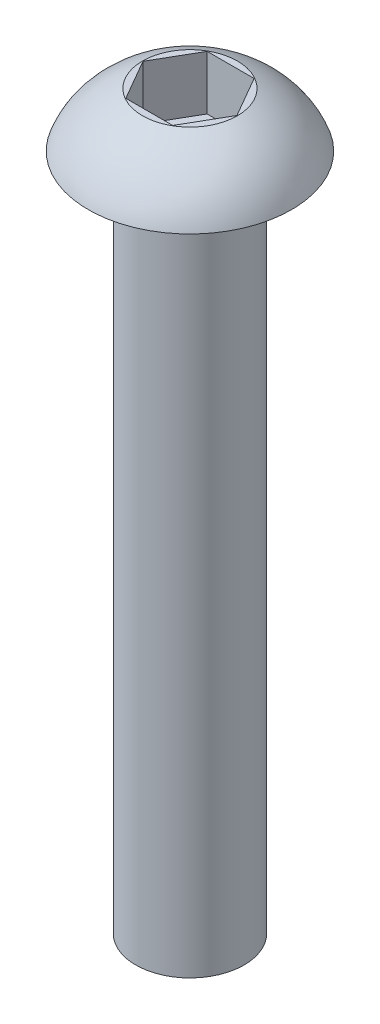
ISO-10303-21;
HEADER;
FILE_DESCRIPTION(('STEP AP214'),'2;1');
FILE_NAME('part.step','',(''),(''),'','','');
FILE_SCHEMA(('AUTOMOTIVE_DESIGN { 1 0 10303 214 1 1 1 1 }'));
ENDSEC;
DATA;
#1=APPLICATION_CONTEXT('core data for automotive mechanical design processes');
#2=APPLICATION_PROTOCOL_DEFINITION('international standard','automotive_design',2000,#1);
#3=PRODUCT_CONTEXT('',#1,'mechanical');
#4=PRODUCT('Part','Part','',(#3));
#5=PRODUCT_RELATED_PRODUCT_CATEGORY('part','',(#4));
#6=PRODUCT_DEFINITION_FORMATION('','',#4);
#7=PRODUCT_DEFINITION_CONTEXT('part definition',#1,'design');
#8=PRODUCT_DEFINITION('design','',#6,#7);
#9=PRODUCT_DEFINITION_SHAPE('','',#8);
#10=(LENGTH_UNIT() NAMED_UNIT(*) SI_UNIT(.MILLI.,.METRE.));
#11=(NAMED_UNIT(*) PLANE_ANGLE_UNIT() SI_UNIT($,.RADIAN.));
#12=(NAMED_UNIT(*) SI_UNIT($,.STERADIAN.) SOLID_ANGLE_UNIT());
#13=UNCERTAINTY_MEASURE_WITH_UNIT(LENGTH_MEASURE(1.E-05),#10,'distance_accuracy_value','');
#14=(GEOMETRIC_REPRESENTATION_CONTEXT(3) GLOBAL_UNCERTAINTY_ASSIGNED_CONTEXT((#13)) GLOBAL_UNIT_ASSIGNED_CONTEXT((#10,
#11,#12)) REPRESENTATION_CONTEXT('',''));
#15=CARTESIAN_POINT('',(0.,0.,0.));
#16=DIRECTION('',(0.,0.,1.));
#17=DIRECTION('',(1.,0.,0.));
#18=AXIS2_PLACEMENT_3D('',#15,#16,#17);
#19=CARTESIAN_POINT('',(0.,-12.5,0.999999999999997));
#20=DIRECTION('',(0.,-1.,0.));
#21=DIRECTION('',(0.,0.,-1.));
#22=AXIS2_PLACEMENT_3D('',#19,#20,#21);
#23=CYLINDRICAL_SURFACE('',#22,2.);
#24=CARTESIAN_POINT('',(0.,-12.5,0.999999999999997));
#25=DIRECTION('',(0.,-1.,0.));
#26=DIRECTION('',(0.,0.,-1.));
#27=AXIS2_PLACEMENT_3D('',#24,#25,#26);
#28=CIRCLE('',#27,2.);
#29=CARTESIAN_POINT('',(0.,-12.5,-1.));
#30=VERTEX_POINT('',#29);
#31=EDGE_CURVE('E165',#30,#30,#28,.T.);
#32=ORIENTED_EDGE('',*,*,#31,.F.);
#33=EDGE_LOOP('',(#32));
#34=FACE_BOUND('',#33,.T.);
#35=CARTESIAN_POINT('',(0.,12.5,1.));
#36=DIRECTION('',(0.,-1.,0.));
#37=DIRECTION('',(0.,0.,-1.));
#38=AXIS2_PLACEMENT_3D('',#35,#36,#37);
#39=CIRCLE('',#38,2.);
#40=CARTESIAN_POINT('',(0.,12.5,-1.));
#41=VERTEX_POINT('',#40);
#42=EDGE_CURVE('E11',#41,#41,#39,.T.);
#43=ORIENTED_EDGE('',*,*,#42,.T.);
#44=EDGE_LOOP('',(#43));
#45=FACE_BOUND('',#44,.T.);
#46=ADVANCED_FACE('F39',(#34,#45),#23,.T.);
#47=CARTESIAN_POINT('',(0.,12.5,0.));
#48=DIRECTION('',(0.,-1.,0.));
#49=DIRECTION('',(0.,0.,-1.));
#50=AXIS2_PLACEMENT_3D('',#47,#48,#49);
#51=PLANE('',#50);
#52=CARTESIAN_POINT('',(0.,12.5,1.));
#53=DIRECTION('',(0.,-1.,0.));
#54=DIRECTION('',(0.,0.,-1.));
#55=AXIS2_PLACEMENT_3D('',#52,#53,#54);
#56=CIRCLE('',#55,3.75);
#57=CARTESIAN_POINT('',(0.,12.5,-2.75));
#58=VERTEX_POINT('',#57);
#59=EDGE_CURVE('E47',#58,#58,#56,.T.);
#60=ORIENTED_EDGE('',*,*,#59,.T.);
#61=EDGE_LOOP('',(#60));
#62=FACE_BOUND('',#61,.T.);
#63=ORIENTED_EDGE('',*,*,#42,.F.);
#64=EDGE_LOOP('',(#63));
#65=FACE_BOUND('',#64,.T.);
#66=ADVANCED_FACE('F178',(#62,#65),#51,.T.);
#67=CARTESIAN_POINT('',(0.,14.5,-0.750000000000003));
#68=CARTESIAN_POINT('',(0.,13.8195725340855,-2.29097588116488));
#69=CARTESIAN_POINT('',(0.,12.5,-2.75));
#70=B_SPLINE_CURVE_WITH_KNOTS('',2,(#67,#68,#69),.UNSPECIFIED.,.F.,.F.,(3,3),(0.,
0.856055688663619),.UNSPECIFIED.);
#71=CARTESIAN_POINT('',(0.,-12.5,0.999999999999997));
#72=DIRECTION('',(0.,-1.,0.));
#73=AXIS1_PLACEMENT('',#71,#72);
#74=SURFACE_OF_REVOLUTION('',#70,#73);
#75=ORIENTED_EDGE('',*,*,#59,.F.);
#76=EDGE_LOOP('',(#75));
#77=FACE_BOUND('',#76,.T.);
#78=CARTESIAN_POINT('',(0.,14.5,1.));
#79=DIRECTION('',(0.,1.,0.));
#80=DIRECTION('',(0.,0.,1.));
#81=AXIS2_PLACEMENT_3D('',#78,#79,#80);
#82=CIRCLE('',#81,1.75);
#83=CARTESIAN_POINT('',(0.,14.5,2.75));
#84=VERTEX_POINT('',#83);
#85=EDGE_CURVE('E109',#84,#84,#82,.T.);
#86=ORIENTED_EDGE('',*,*,#85,.F.);
#87=EDGE_LOOP('',(#86));
#88=FACE_BOUND('',#87,.T.);
#89=ADVANCED_FACE('F174',(#77,#88),#74,.T.);
#90=CARTESIAN_POINT('',(0.,-12.5,0.));
#91=DIRECTION('',(0.,-1.,0.));
#92=DIRECTION('',(0.,0.,-1.));
#93=AXIS2_PLACEMENT_3D('',#90,#91,#92);
#94=PLANE('',#93);
#95=ORIENTED_EDGE('',*,*,#31,.T.);
#96=EDGE_LOOP('',(#95));
#97=FACE_BOUND('',#96,.T.);
#98=ADVANCED_FACE('F177',(#97),#94,.T.);
#99=CARTESIAN_POINT('',(0.,14.5,1.));
#100=DIRECTION('',(0.,1.,0.));
#101=DIRECTION('',(0.,0.,1.));
#102=AXIS2_PLACEMENT_3D('',#99,#100,#101);
#103=PLANE('',#102);
#104=ORIENTED_EDGE('',*,*,#85,.T.);
#105=EDGE_LOOP('',(#104));
#106=FACE_BOUND('',#105,.T.);
#107=DIRECTION('',(-0.5,0.,-0.866025403784438));
#108=VECTOR('',#107,1.);
#109=CARTESIAN_POINT('',(1.73205080756888,14.5,1.));
#110=LINE('',#109,#108);
#111=CARTESIAN_POINT('',(1.73205080756888,14.5,1.));
#112=VERTEX_POINT('',#111);
#113=CARTESIAN_POINT('',(0.866025403784438,14.5,-0.5));
#114=VERTEX_POINT('',#113);
#115=EDGE_CURVE('E100',#112,#114,#110,.T.);
#116=ORIENTED_EDGE('',*,*,#115,.F.);
#117=DIRECTION('',(0.5,0.,-0.866025403784439));
#118=VECTOR('',#117,1.);
#119=CARTESIAN_POINT('',(0.866025403784438,14.5,2.5));
#120=LINE('',#119,#118);
#121=CARTESIAN_POINT('',(0.866025403784438,14.5,2.5));
#122=VERTEX_POINT('',#121);
#123=EDGE_CURVE('E91',#122,#112,#120,.T.);
#124=ORIENTED_EDGE('',*,*,#123,.F.);
#125=DIRECTION('',(1.,0.,0.));
#126=VECTOR('',#125,1.);
#127=CARTESIAN_POINT('',(-0.866025403784439,14.5,2.5));
#128=LINE('',#127,#126);
#129=CARTESIAN_POINT('',(-0.866025403784439,14.5,2.5));
#130=VERTEX_POINT('',#129);
#131=EDGE_CURVE('E127',#130,#122,#128,.T.);
#132=ORIENTED_EDGE('',*,*,#131,.F.);
#133=DIRECTION('',(0.5,0.,0.866025403784439));
#134=VECTOR('',#133,1.);
#135=CARTESIAN_POINT('',(-1.73205080756888,14.5,1.));
#136=LINE('',#135,#134);
#137=CARTESIAN_POINT('',(-1.73205080756888,14.5,1.));
#138=VERTEX_POINT('',#137);
#139=EDGE_CURVE('E124',#138,#130,#136,.T.);
#140=ORIENTED_EDGE('',*,*,#139,.F.);
#141=DIRECTION('',(-0.5,0.,0.866025403784439));
#142=VECTOR('',#141,1.);
#143=CARTESIAN_POINT('',(-0.866025403784439,14.5,-0.5));
#144=LINE('',#143,#142);
#145=CARTESIAN_POINT('',(-0.866025403784439,14.5,-0.5));
#146=VERTEX_POINT('',#145);
#147=EDGE_CURVE('E119',#146,#138,#144,.T.);
#148=ORIENTED_EDGE('',*,*,#147,.F.);
#149=DIRECTION('',(-1.,0.,0.));
#150=VECTOR('',#149,1.);
#151=CARTESIAN_POINT('',(0.866025403784438,14.5,-0.5));
#152=LINE('',#151,#150);
#153=EDGE_CURVE('E115',#114,#146,#152,.T.);
#154=ORIENTED_EDGE('',*,*,#153,.F.);
#155=EDGE_LOOP('',(#116,#124,#132,#140,#148,#154));
#156=FACE_BOUND('',#155,.T.);
#157=ADVANCED_FACE('F113',(#106,#156),#103,.T.);
#158=CARTESIAN_POINT('',(0.866025403784438,14.5,2.5));
#159=DIRECTION('',(-0.866025403784439,0.,-0.5));
#160=DIRECTION('',(-0.5,0.,0.866025403784439));
#161=AXIS2_PLACEMENT_3D('',#158,#159,#160);
#162=PLANE('',#161);
#163=DIRECTION('',(0.5,0.,-0.866025403784439));
#164=VECTOR('',#163,1.);
#165=CARTESIAN_POINT('',(0.866025403784438,12.5,2.5));
#166=LINE('',#165,#164);
#167=CARTESIAN_POINT('',(0.866025403784438,12.5,2.5));
#168=VERTEX_POINT('',#167);
#169=CARTESIAN_POINT('',(1.73205080756888,12.5,1.));
#170=VERTEX_POINT('',#169);
#171=EDGE_CURVE('E130',#168,#170,#166,.T.);
#172=ORIENTED_EDGE('',*,*,#171,.F.);
#173=DIRECTION('',(0.,-1.,0.));
#174=VECTOR('',#173,1.);
#175=CARTESIAN_POINT('',(0.866025403784438,14.5,2.5));
#176=LINE('',#175,#174);
#177=EDGE_CURVE('E54',#122,#168,#176,.T.);
#178=ORIENTED_EDGE('',*,*,#177,.F.);
#179=ORIENTED_EDGE('',*,*,#123,.T.);
#180=DIRECTION('',(0.,-1.,0.));
#181=VECTOR('',#180,1.);
#182=CARTESIAN_POINT('',(1.73205080756888,14.5,1.));
#183=LINE('',#182,#181);
#184=EDGE_CURVE('E94',#112,#170,#183,.T.);
#185=ORIENTED_EDGE('',*,*,#184,.T.);
#186=EDGE_LOOP('',(#172,#178,#179,#185));
#187=FACE_BOUND('',#186,.T.);
#188=ADVANCED_FACE('F93',(#187),#162,.T.);
#189=CARTESIAN_POINT('',(1.73205080756888,14.5,1.));
#190=DIRECTION('',(-0.866025403784439,0.,0.5));
#191=DIRECTION('',(0.5,0.,0.866025403784438));
#192=AXIS2_PLACEMENT_3D('',#189,#190,#191);
#193=PLANE('',#192);
#194=DIRECTION('',(-0.5,0.,-0.866025403784438));
#195=VECTOR('',#194,1.);
#196=CARTESIAN_POINT('',(1.73205080756888,12.5,1.));
#197=LINE('',#196,#195);
#198=CARTESIAN_POINT('',(0.866025403784438,12.5,-0.5));
#199=VERTEX_POINT('',#198);
#200=EDGE_CURVE('E107',#170,#199,#197,.T.);
#201=ORIENTED_EDGE('',*,*,#200,.F.);
#202=ORIENTED_EDGE('',*,*,#184,.F.);
#203=ORIENTED_EDGE('',*,*,#115,.T.);
#204=DIRECTION('',(0.,-1.,0.));
#205=VECTOR('',#204,1.);
#206=CARTESIAN_POINT('',(0.866025403784438,14.5,-0.5));
#207=LINE('',#206,#205);
#208=EDGE_CURVE('E110',#114,#199,#207,.T.);
#209=ORIENTED_EDGE('',*,*,#208,.T.);
#210=EDGE_LOOP('',(#201,#202,#203,#209));
#211=FACE_BOUND('',#210,.T.);
#212=ADVANCED_FACE('F104',(#211),#193,.T.);
#213=CARTESIAN_POINT('',(0.866025403784438,14.5,-0.5));
#214=DIRECTION('',(0.,0.,1.));
#215=DIRECTION('',(1.,0.,0.));
#216=AXIS2_PLACEMENT_3D('',#213,#214,#215);
#217=PLANE('',#216);
#218=DIRECTION('',(-1.,0.,0.));
#219=VECTOR('',#218,1.);
#220=CARTESIAN_POINT('',(0.866025403784438,12.5,-0.5));
#221=LINE('',#220,#219);
#222=CARTESIAN_POINT('',(-0.866025403784439,12.5,-0.5));
#223=VERTEX_POINT('',#222);
#224=EDGE_CURVE('E135',#199,#223,#221,.T.);
#225=ORIENTED_EDGE('',*,*,#224,.F.);
#226=ORIENTED_EDGE('',*,*,#208,.F.);
#227=ORIENTED_EDGE('',*,*,#153,.T.);
#228=DIRECTION('',(0.,-1.,0.));
#229=VECTOR('',#228,1.);
#230=CARTESIAN_POINT('',(-0.866025403784439,14.5,-0.5));
#231=LINE('',#230,#229);
#232=EDGE_CURVE('E157',#146,#223,#231,.T.);
#233=ORIENTED_EDGE('',*,*,#232,.T.);
#234=EDGE_LOOP('',(#225,#226,#227,#233));
#235=FACE_BOUND('',#234,.T.);
#236=ADVANCED_FACE('F209',(#235),#217,.T.);
#237=CARTESIAN_POINT('',(-0.866025403784439,14.5,-0.5));
#238=DIRECTION('',(0.866025403784439,0.,0.5));
#239=DIRECTION('',(0.5,0.,-0.866025403784439));
#240=AXIS2_PLACEMENT_3D('',#237,#238,#239);
#241=PLANE('',#240);
#242=DIRECTION('',(-0.5,0.,0.866025403784439));
#243=VECTOR('',#242,1.);
#244=CARTESIAN_POINT('',(-0.866025403784439,12.5,-0.5));
#245=LINE('',#244,#243);
#246=CARTESIAN_POINT('',(-1.73205080756888,12.5,1.));
#247=VERTEX_POINT('',#246);
#248=EDGE_CURVE('E139',#223,#247,#245,.T.);
#249=ORIENTED_EDGE('',*,*,#248,.F.);
#250=ORIENTED_EDGE('',*,*,#232,.F.);
#251=ORIENTED_EDGE('',*,*,#147,.T.);
#252=DIRECTION('',(0.,-1.,0.));
#253=VECTOR('',#252,1.);
#254=CARTESIAN_POINT('',(-1.73205080756888,14.5,1.));
#255=LINE('',#254,#253);
#256=EDGE_CURVE('E154',#138,#247,#255,.T.);
#257=ORIENTED_EDGE('',*,*,#256,.T.);
#258=EDGE_LOOP('',(#249,#250,#251,#257));
#259=FACE_BOUND('',#258,.T.);
#260=ADVANCED_FACE('F212',(#259),#241,.T.);
#261=CARTESIAN_POINT('',(-1.73205080756888,14.5,1.));
#262=DIRECTION('',(0.866025403784439,0.,-0.5));
#263=DIRECTION('',(-0.5,0.,-0.866025403784439));
#264=AXIS2_PLACEMENT_3D('',#261,#262,#263);
#265=PLANE('',#264);
#266=DIRECTION('',(0.5,0.,0.866025403784439));
#267=VECTOR('',#266,1.);
#268=CARTESIAN_POINT('',(-1.73205080756888,12.5,1.));
#269=LINE('',#268,#267);
#270=CARTESIAN_POINT('',(-0.866025403784439,12.5,2.5));
#271=VERTEX_POINT('',#270);
#272=EDGE_CURVE('E143',#247,#271,#269,.T.);
#273=ORIENTED_EDGE('',*,*,#272,.F.);
#274=ORIENTED_EDGE('',*,*,#256,.F.);
#275=ORIENTED_EDGE('',*,*,#139,.T.);
#276=DIRECTION('',(0.,-1.,0.));
#277=VECTOR('',#276,1.);
#278=CARTESIAN_POINT('',(-0.866025403784439,14.5,2.5));
#279=LINE('',#278,#277);
#280=EDGE_CURVE('E59',#130,#271,#279,.T.);
#281=ORIENTED_EDGE('',*,*,#280,.T.);
#282=EDGE_LOOP('',(#273,#274,#275,#281));
#283=FACE_BOUND('',#282,.T.);
#284=ADVANCED_FACE('F216',(#283),#265,.T.);
#285=CARTESIAN_POINT('',(-0.866025403784439,14.5,2.5));
#286=DIRECTION('',(0.,0.,-1.));
#287=DIRECTION('',(-1.,0.,0.));
#288=AXIS2_PLACEMENT_3D('',#285,#286,#287);
#289=PLANE('',#288);
#290=DIRECTION('',(1.,0.,0.));
#291=VECTOR('',#290,1.);
#292=CARTESIAN_POINT('',(-0.866025403784439,12.5,2.5));
#293=LINE('',#292,#291);
#294=EDGE_CURVE('E101',#271,#168,#293,.T.);
#295=ORIENTED_EDGE('',*,*,#294,.F.);
#296=ORIENTED_EDGE('',*,*,#280,.F.);
#297=ORIENTED_EDGE('',*,*,#131,.T.);
#298=ORIENTED_EDGE('',*,*,#177,.T.);
#299=EDGE_LOOP('',(#295,#296,#297,#298));
#300=FACE_BOUND('',#299,.T.);
#301=ADVANCED_FACE('F220',(#300),#289,.T.);
#302=CARTESIAN_POINT('',(0.,12.5,0.));
#303=DIRECTION('',(0.,-1.,0.));
#304=DIRECTION('',(0.,0.,-1.));
#305=AXIS2_PLACEMENT_3D('',#302,#303,#304);
#306=PLANE('',#305);
#307=ORIENTED_EDGE('',*,*,#294,.T.);
#308=ORIENTED_EDGE('',*,*,#171,.T.);
#309=ORIENTED_EDGE('',*,*,#200,.T.);
#310=ORIENTED_EDGE('',*,*,#224,.T.);
#311=ORIENTED_EDGE('',*,*,#248,.T.);
#312=ORIENTED_EDGE('',*,*,#272,.T.);
#313=EDGE_LOOP('',(#307,#308,#309,#310,#311,#312));
#314=FACE_BOUND('',#313,.T.);
#315=ADVANCED_FACE('F180',(#314),#306,.F.);
#316=CLOSED_SHELL('',(#46,#66,#89,#98,#157,#188,#212,#236,#260,#284,#301,#315));
#317=MANIFOLD_SOLID_BREP('B2',#316);
#318=ADVANCED_BREP_SHAPE_REPRESENTATION('',(#18,#317),#14);
#319=SHAPE_DEFINITION_REPRESENTATION(#9,#318);
ENDSEC;
END-ISO-10303-21;
